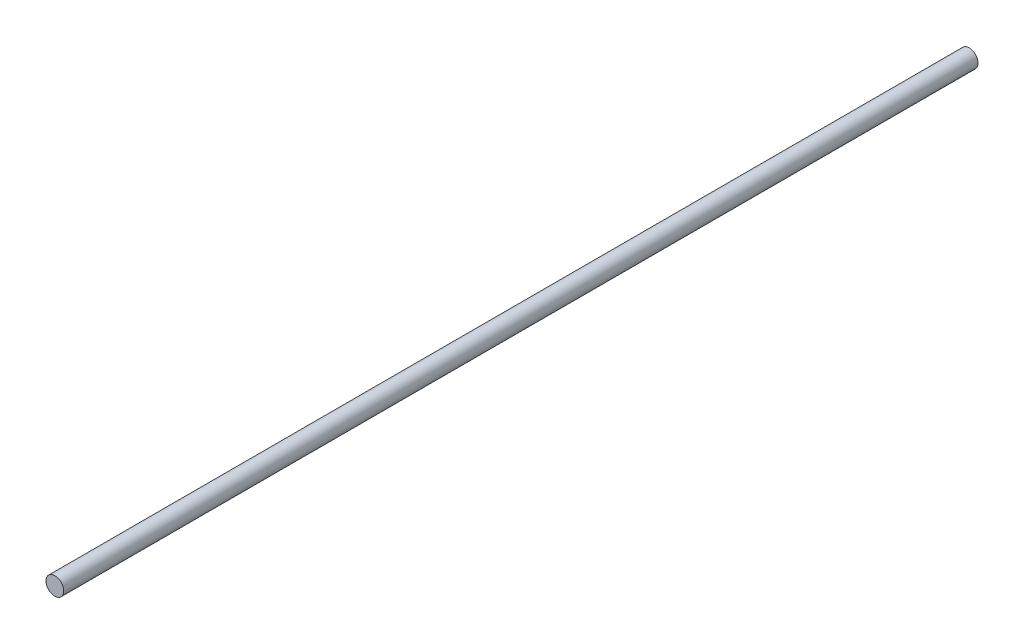
ISO-10303-21;
HEADER;
FILE_DESCRIPTION(('STEP AP214'),'2;1');
FILE_NAME('part.step','',(''),(''),'','','');
FILE_SCHEMA(('AUTOMOTIVE_DESIGN { 1 0 10303 214 1 1 1 1 }'));
ENDSEC;
DATA;
#1=APPLICATION_CONTEXT('core data for automotive mechanical design processes');
#2=APPLICATION_PROTOCOL_DEFINITION('international standard','automotive_design',2000,#1);
#3=PRODUCT_CONTEXT('',#1,'mechanical');
#4=PRODUCT('Part','Part','',(#3));
#5=PRODUCT_RELATED_PRODUCT_CATEGORY('part','',(#4));
#6=PRODUCT_DEFINITION_FORMATION('','',#4);
#7=PRODUCT_DEFINITION_CONTEXT('part definition',#1,'design');
#8=PRODUCT_DEFINITION('design','',#6,#7);
#9=PRODUCT_DEFINITION_SHAPE('','',#8);
#10=(LENGTH_UNIT() NAMED_UNIT(*) SI_UNIT(.MILLI.,.METRE.));
#11=(NAMED_UNIT(*) PLANE_ANGLE_UNIT() SI_UNIT($,.RADIAN.));
#12=(NAMED_UNIT(*) SI_UNIT($,.STERADIAN.) SOLID_ANGLE_UNIT());
#13=UNCERTAINTY_MEASURE_WITH_UNIT(LENGTH_MEASURE(1.E-05),#10,'distance_accuracy_value','');
#14=(GEOMETRIC_REPRESENTATION_CONTEXT(3) GLOBAL_UNCERTAINTY_ASSIGNED_CONTEXT((#13)) GLOBAL_UNIT_ASSIGNED_CONTEXT((#10,
#11,#12)) REPRESENTATION_CONTEXT('',''));
#15=CARTESIAN_POINT('',(0.,0.,0.));
#16=DIRECTION('',(0.,0.,1.));
#17=DIRECTION('',(1.,0.,0.));
#18=AXIS2_PLACEMENT_3D('',#15,#16,#17);
#19=CARTESIAN_POINT('',(0.,0.,152.24));
#20=DIRECTION('',(0.,0.,-1.));
#21=DIRECTION('',(-1.,0.,0.));
#22=AXIS2_PLACEMENT_3D('',#19,#20,#21);
#23=CYLINDRICAL_SURFACE('',#22,1.475);
#24=CARTESIAN_POINT('',(0.,0.,152.24));
#25=DIRECTION('',(0.,0.,1.));
#26=DIRECTION('',(1.,0.,0.));
#27=AXIS2_PLACEMENT_3D('',#24,#25,#26);
#28=CIRCLE('',#27,1.475);
#29=CARTESIAN_POINT('',(1.475,0.,152.24));
#30=VERTEX_POINT('',#29);
#31=EDGE_CURVE('E10',#30,#30,#28,.T.);
#32=ORIENTED_EDGE('',*,*,#31,.F.);
#33=EDGE_LOOP('',(#32));
#34=FACE_BOUND('',#33,.T.);
#35=CARTESIAN_POINT('',(0.,0.,0.));
#36=DIRECTION('',(0.,0.,1.));
#37=DIRECTION('',(1.,0.,0.));
#38=AXIS2_PLACEMENT_3D('',#35,#36,#37);
#39=CIRCLE('',#38,1.475);
#40=CARTESIAN_POINT('',(1.475,0.,0.));
#41=VERTEX_POINT('',#40);
#42=EDGE_CURVE('E33',#41,#41,#39,.T.);
#43=ORIENTED_EDGE('',*,*,#42,.T.);
#44=EDGE_LOOP('',(#43));
#45=FACE_BOUND('',#44,.T.);
#46=ADVANCED_FACE('F30',(#34,#45),#23,.T.);
#47=CARTESIAN_POINT('',(0.,0.,152.24));
#48=DIRECTION('',(0.,0.,1.));
#49=DIRECTION('',(1.,0.,0.));
#50=AXIS2_PLACEMENT_3D('',#47,#48,#49);
#51=PLANE('',#50);
#52=ORIENTED_EDGE('',*,*,#31,.T.);
#53=EDGE_LOOP('',(#52));
#54=FACE_BOUND('',#53,.T.);
#55=ADVANCED_FACE('F45',(#54),#51,.T.);
#56=CARTESIAN_POINT('',(0.,0.,0.));
#57=DIRECTION('',(0.,0.,1.));
#58=DIRECTION('',(1.,0.,0.));
#59=AXIS2_PLACEMENT_3D('',#56,#57,#58);
#60=PLANE('',#59);
#61=ORIENTED_EDGE('',*,*,#42,.F.);
#62=EDGE_LOOP('',(#61));
#63=FACE_BOUND('',#62,.T.);
#64=ADVANCED_FACE('F43',(#63),#60,.F.);
#65=CLOSED_SHELL('',(#46,#55,#64));
#66=MANIFOLD_SOLID_BREP('B2',#65);
#67=ADVANCED_BREP_SHAPE_REPRESENTATION('',(#18,#66),#14);
#68=SHAPE_DEFINITION_REPRESENTATION(#9,#67);
ENDSEC;
END-ISO-10303-21;
